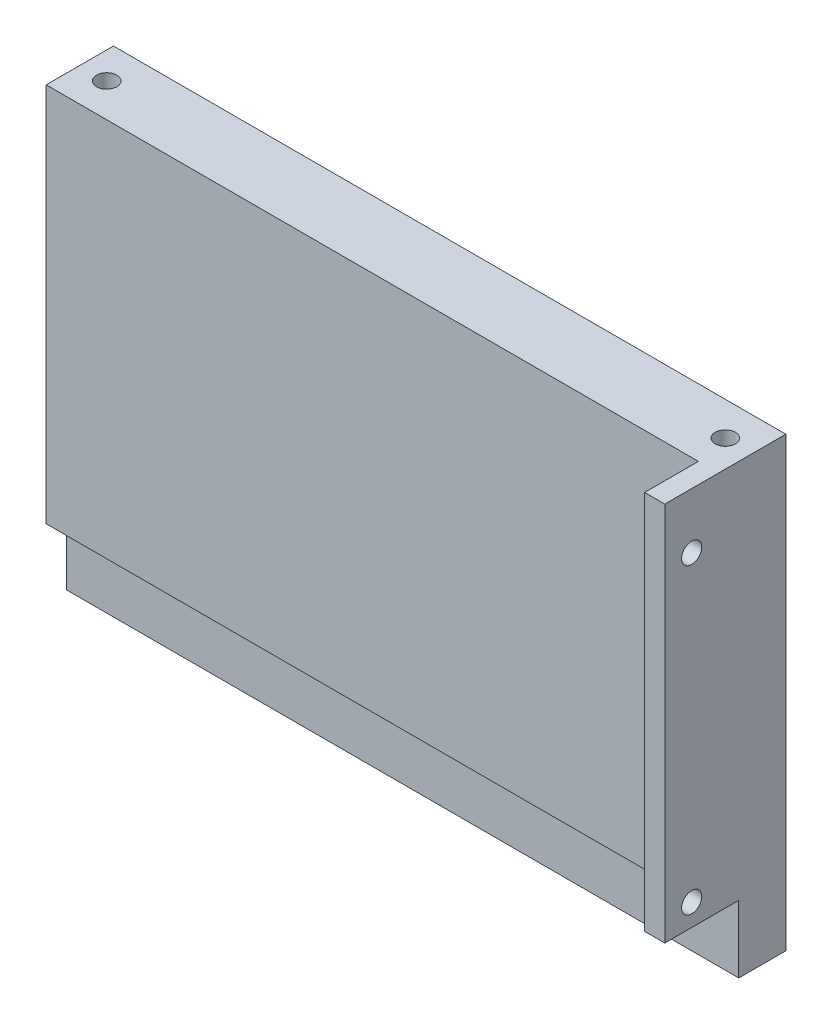
ISO-10303-21;
HEADER;
FILE_DESCRIPTION(('STEP AP214'),'2;1');
FILE_NAME('part.step','',(''),(''),'','','');
FILE_SCHEMA(('AUTOMOTIVE_DESIGN { 1 0 10303 214 1 1 1 1 }'));
ENDSEC;
DATA;
#1=APPLICATION_CONTEXT('core data for automotive mechanical design processes');
#2=APPLICATION_PROTOCOL_DEFINITION('international standard','automotive_design',2000,#1);
#3=PRODUCT_CONTEXT('',#1,'mechanical');
#4=PRODUCT('Part','Part','',(#3));
#5=PRODUCT_RELATED_PRODUCT_CATEGORY('part','',(#4));
#6=PRODUCT_DEFINITION_FORMATION('','',#4);
#7=PRODUCT_DEFINITION_CONTEXT('part definition',#1,'design');
#8=PRODUCT_DEFINITION('design','',#6,#7);
#9=PRODUCT_DEFINITION_SHAPE('','',#8);
#10=(LENGTH_UNIT() NAMED_UNIT(*) SI_UNIT(.MILLI.,.METRE.));
#11=(NAMED_UNIT(*) PLANE_ANGLE_UNIT() SI_UNIT($,.RADIAN.));
#12=(NAMED_UNIT(*) SI_UNIT($,.STERADIAN.) SOLID_ANGLE_UNIT());
#13=UNCERTAINTY_MEASURE_WITH_UNIT(LENGTH_MEASURE(1.E-05),#10,'distance_accuracy_value','');
#14=(GEOMETRIC_REPRESENTATION_CONTEXT(3) GLOBAL_UNCERTAINTY_ASSIGNED_CONTEXT((#13)) GLOBAL_UNIT_ASSIGNED_CONTEXT((#10,
#11,#12)) REPRESENTATION_CONTEXT('',''));
#15=CARTESIAN_POINT('',(0.,0.,0.));
#16=DIRECTION('',(0.,0.,1.));
#17=DIRECTION('',(1.,0.,0.));
#18=AXIS2_PLACEMENT_3D('',#15,#16,#17);
#19=CARTESIAN_POINT('',(-50.,66.54,5.));
#20=DIRECTION('',(0.,0.,-1.));
#21=DIRECTION('',(-1.,0.,0.));
#22=AXIS2_PLACEMENT_3D('',#19,#20,#21);
#23=PLANE('',#22);
#24=DIRECTION('',(0.,-1.,0.));
#25=VECTOR('',#24,1.);
#26=CARTESIAN_POINT('',(47.,66.54,5.));
#27=LINE('',#26,#25);
#28=CARTESIAN_POINT('',(47.,66.54,5.));
#29=VERTEX_POINT('',#28);
#30=CARTESIAN_POINT('',(47.,10.,5.));
#31=VERTEX_POINT('',#30);
#32=EDGE_CURVE('E58',#29,#31,#27,.T.);
#33=ORIENTED_EDGE('',*,*,#32,.F.);
#34=DIRECTION('',(1.,0.,0.));
#35=VECTOR('',#34,1.);
#36=CARTESIAN_POINT('',(-50.,66.54,5.));
#37=LINE('',#36,#35);
#38=CARTESIAN_POINT('',(-50.,66.54,5.));
#39=VERTEX_POINT('',#38);
#40=EDGE_CURVE('E197',#39,#29,#37,.T.);
#41=ORIENTED_EDGE('',*,*,#40,.F.);
#42=DIRECTION('',(0.,-1.,0.));
#43=VECTOR('',#42,1.);
#44=CARTESIAN_POINT('',(-50.,66.54,5.));
#45=LINE('',#44,#43);
#46=CARTESIAN_POINT('',(-50.,10.,5.));
#47=VERTEX_POINT('',#46);
#48=EDGE_CURVE('E200',#39,#47,#45,.T.);
#49=ORIENTED_EDGE('',*,*,#48,.T.);
#50=DIRECTION('',(-1.,0.,0.));
#51=VECTOR('',#50,1.);
#52=CARTESIAN_POINT('',(-50.,10.,5.));
#53=LINE('',#52,#51);
#54=EDGE_CURVE('E154',#31,#47,#53,.T.);
#55=ORIENTED_EDGE('',*,*,#54,.F.);
#56=EDGE_LOOP('',(#33,#41,#49,#55));
#57=FACE_BOUND('',#56,.T.);
#58=ADVANCED_FACE('F42',(#57),#23,.F.);
#59=CARTESIAN_POINT('',(50.,66.54,5.));
#60=DIRECTION('',(-1.,0.,0.));
#61=DIRECTION('',(0.,0.,1.));
#62=AXIS2_PLACEMENT_3D('',#59,#60,#61);
#63=PLANE('',#62);
#64=CARTESIAN_POINT('',(50.,58.27,9.));
#65=DIRECTION('',(1.,0.,0.));
#66=DIRECTION('',(0.,0.,-1.));
#67=AXIS2_PLACEMENT_3D('',#64,#65,#66);
#68=CIRCLE('',#67,1.5);
#69=CARTESIAN_POINT('',(50.,58.27,7.5));
#70=VERTEX_POINT('',#69);
#71=EDGE_CURVE('E397',#70,#70,#68,.T.);
#72=ORIENTED_EDGE('',*,*,#71,.F.);
#73=EDGE_LOOP('',(#72));
#74=FACE_BOUND('',#73,.T.);
#75=CARTESIAN_POINT('',(50.,13.27,9.));
#76=DIRECTION('',(1.,0.,0.));
#77=DIRECTION('',(0.,0.,-1.));
#78=AXIS2_PLACEMENT_3D('',#75,#76,#77);
#79=CIRCLE('',#78,1.5);
#80=CARTESIAN_POINT('',(50.,13.27,7.5));
#81=VERTEX_POINT('',#80);
#82=EDGE_CURVE('E141',#81,#81,#79,.T.);
#83=ORIENTED_EDGE('',*,*,#82,.F.);
#84=EDGE_LOOP('',(#83));
#85=FACE_BOUND('',#84,.T.);
#86=DIRECTION('',(0.,0.,-1.));
#87=VECTOR('',#86,1.);
#88=CARTESIAN_POINT('',(50.,66.54,5.));
#89=LINE('',#88,#87);
#90=CARTESIAN_POINT('',(50.,66.54,13.));
#91=VERTEX_POINT('',#90);
#92=CARTESIAN_POINT('',(50.,66.54,-5.));
#93=VERTEX_POINT('',#92);
#94=EDGE_CURVE('E111',#91,#93,#89,.T.);
#95=ORIENTED_EDGE('',*,*,#94,.F.);
#96=DIRECTION('',(0.,1.,0.));
#97=VECTOR('',#96,1.);
#98=CARTESIAN_POINT('',(50.,66.54,13.));
#99=LINE('',#98,#97);
#100=CARTESIAN_POINT('',(50.,10.,13.));
#101=VERTEX_POINT('',#100);
#102=EDGE_CURVE('E115',#101,#91,#99,.T.);
#103=ORIENTED_EDGE('',*,*,#102,.F.);
#104=DIRECTION('',(0.,0.,1.));
#105=VECTOR('',#104,1.);
#106=CARTESIAN_POINT('',(50.,10.,2.));
#107=LINE('',#106,#105);
#108=CARTESIAN_POINT('',(50.,10.,2.));
#109=VERTEX_POINT('',#108);
#110=EDGE_CURVE('E166',#109,#101,#107,.T.);
#111=ORIENTED_EDGE('',*,*,#110,.F.);
#112=DIRECTION('',(0.,1.,0.));
#113=VECTOR('',#112,1.);
#114=CARTESIAN_POINT('',(50.,0.,2.));
#115=LINE('',#114,#113);
#116=CARTESIAN_POINT('',(50.,0.,2.));
#117=VERTEX_POINT('',#116);
#118=EDGE_CURVE('E160',#117,#109,#115,.T.);
#119=ORIENTED_EDGE('',*,*,#118,.F.);
#120=DIRECTION('',(0.,0.,-1.));
#121=VECTOR('',#120,1.);
#122=CARTESIAN_POINT('',(50.,0.,5.));
#123=LINE('',#122,#121);
#124=CARTESIAN_POINT('',(50.,0.,-5.));
#125=VERTEX_POINT('',#124);
#126=EDGE_CURVE('E188',#117,#125,#123,.T.);
#127=ORIENTED_EDGE('',*,*,#126,.T.);
#128=DIRECTION('',(0.,-1.,0.));
#129=VECTOR('',#128,1.);
#130=CARTESIAN_POINT('',(50.,66.54,-5.));
#131=LINE('',#130,#129);
#132=EDGE_CURVE('E11',#93,#125,#131,.T.);
#133=ORIENTED_EDGE('',*,*,#132,.F.);
#134=EDGE_LOOP('',(#95,#103,#111,#119,#127,#133));
#135=FACE_BOUND('',#134,.T.);
#136=ADVANCED_FACE('F44',(#74,#85,#135),#63,.F.);
#137=CARTESIAN_POINT('',(-50.,66.54,-5.));
#138=DIRECTION('',(0.,0.,1.));
#139=DIRECTION('',(1.,0.,0.));
#140=AXIS2_PLACEMENT_3D('',#137,#138,#139);
#141=PLANE('',#140);
#142=DIRECTION('',(-1.,0.,0.));
#143=VECTOR('',#142,1.);
#144=CARTESIAN_POINT('',(-50.,0.,-5.));
#145=LINE('',#144,#143);
#146=CARTESIAN_POINT('',(-50.,0.,-5.));
#147=VERTEX_POINT('',#146);
#148=EDGE_CURVE('E203',#125,#147,#145,.T.);
#149=ORIENTED_EDGE('',*,*,#148,.T.);
#150=DIRECTION('',(0.,-1.,0.));
#151=VECTOR('',#150,1.);
#152=CARTESIAN_POINT('',(-50.,66.54,-5.));
#153=LINE('',#152,#151);
#154=CARTESIAN_POINT('',(-50.,66.54,-5.));
#155=VERTEX_POINT('',#154);
#156=EDGE_CURVE('E51',#155,#147,#153,.T.);
#157=ORIENTED_EDGE('',*,*,#156,.F.);
#158=DIRECTION('',(-1.,0.,0.));
#159=VECTOR('',#158,1.);
#160=CARTESIAN_POINT('',(-50.,66.54,-5.));
#161=LINE('',#160,#159);
#162=EDGE_CURVE('E118',#93,#155,#161,.T.);
#163=ORIENTED_EDGE('',*,*,#162,.F.);
#164=ORIENTED_EDGE('',*,*,#132,.T.);
#165=EDGE_LOOP('',(#149,#157,#163,#164));
#166=FACE_BOUND('',#165,.T.);
#167=ADVANCED_FACE('F250',(#166),#141,.F.);
#168=CARTESIAN_POINT('',(-50.,66.54,5.));
#169=DIRECTION('',(1.,0.,0.));
#170=DIRECTION('',(0.,0.,-1.));
#171=AXIS2_PLACEMENT_3D('',#168,#169,#170);
#172=PLANE('',#171);
#173=DIRECTION('',(0.,-1.,0.));
#174=VECTOR('',#173,1.);
#175=CARTESIAN_POINT('',(-50.,0.,2.));
#176=LINE('',#175,#174);
#177=CARTESIAN_POINT('',(-50.,10.,2.));
#178=VERTEX_POINT('',#177);
#179=CARTESIAN_POINT('',(-50.,0.,2.));
#180=VERTEX_POINT('',#179);
#181=EDGE_CURVE('E66',#178,#180,#176,.T.);
#182=ORIENTED_EDGE('',*,*,#181,.F.);
#183=DIRECTION('',(0.,0.,1.));
#184=VECTOR('',#183,1.);
#185=CARTESIAN_POINT('',(-50.,10.,2.));
#186=LINE('',#185,#184);
#187=EDGE_CURVE('E169',#178,#47,#186,.T.);
#188=ORIENTED_EDGE('',*,*,#187,.T.);
#189=ORIENTED_EDGE('',*,*,#48,.F.);
#190=DIRECTION('',(0.,0.,1.));
#191=VECTOR('',#190,1.);
#192=CARTESIAN_POINT('',(-50.,66.54,5.));
#193=LINE('',#192,#191);
#194=EDGE_CURVE('E194',#155,#39,#193,.T.);
#195=ORIENTED_EDGE('',*,*,#194,.F.);
#196=ORIENTED_EDGE('',*,*,#156,.T.);
#197=DIRECTION('',(0.,0.,1.));
#198=VECTOR('',#197,1.);
#199=CARTESIAN_POINT('',(-50.,0.,5.));
#200=LINE('',#199,#198);
#201=EDGE_CURVE('E119',#147,#180,#200,.T.);
#202=ORIENTED_EDGE('',*,*,#201,.T.);
#203=EDGE_LOOP('',(#182,#188,#189,#195,#196,#202));
#204=FACE_BOUND('',#203,.T.);
#205=ADVANCED_FACE('F217',(#204),#172,.F.);
#206=CARTESIAN_POINT('',(0.,66.54,0.));
#207=DIRECTION('',(0.,-1.,0.));
#208=DIRECTION('',(0.,0.,-1.));
#209=AXIS2_PLACEMENT_3D('',#206,#207,#208);
#210=PLANE('',#209);
#211=CARTESIAN_POINT('',(46.,66.54,0.));
#212=DIRECTION('',(0.,1.,0.));
#213=DIRECTION('',(0.,0.,1.));
#214=AXIS2_PLACEMENT_3D('',#211,#212,#213);
#215=CIRCLE('',#214,1.5);
#216=CARTESIAN_POINT('',(46.,66.54,1.5));
#217=VERTEX_POINT('',#216);
#218=EDGE_CURVE('E176',#217,#217,#215,.T.);
#219=ORIENTED_EDGE('',*,*,#218,.F.);
#220=EDGE_LOOP('',(#219));
#221=FACE_BOUND('',#220,.T.);
#222=CARTESIAN_POINT('',(-46.,66.54,0.));
#223=DIRECTION('',(0.,1.,0.));
#224=DIRECTION('',(0.,0.,1.));
#225=AXIS2_PLACEMENT_3D('',#222,#223,#224);
#226=CIRCLE('',#225,1.5);
#227=CARTESIAN_POINT('',(-46.,66.54,1.5));
#228=VERTEX_POINT('',#227);
#229=EDGE_CURVE('E184',#228,#228,#226,.T.);
#230=ORIENTED_EDGE('',*,*,#229,.F.);
#231=EDGE_LOOP('',(#230));
#232=FACE_BOUND('',#231,.T.);
#233=ORIENTED_EDGE('',*,*,#94,.T.);
#234=ORIENTED_EDGE('',*,*,#162,.T.);
#235=ORIENTED_EDGE('',*,*,#194,.T.);
#236=ORIENTED_EDGE('',*,*,#40,.T.);
#237=DIRECTION('',(0.,0.,-1.));
#238=VECTOR('',#237,1.);
#239=CARTESIAN_POINT('',(47.,66.54,13.));
#240=LINE('',#239,#238);
#241=CARTESIAN_POINT('',(47.,66.54,13.));
#242=VERTEX_POINT('',#241);
#243=EDGE_CURVE('E125',#242,#29,#240,.T.);
#244=ORIENTED_EDGE('',*,*,#243,.F.);
#245=DIRECTION('',(-1.,0.,0.));
#246=VECTOR('',#245,1.);
#247=CARTESIAN_POINT('',(50.,66.54,13.));
#248=LINE('',#247,#246);
#249=EDGE_CURVE('E122',#91,#242,#248,.T.);
#250=ORIENTED_EDGE('',*,*,#249,.F.);
#251=EDGE_LOOP('',(#233,#234,#235,#236,#244,#250));
#252=FACE_BOUND('',#251,.T.);
#253=ADVANCED_FACE('F123',(#221,#232,#252),#210,.F.);
#254=CARTESIAN_POINT('',(0.,0.,0.));
#255=DIRECTION('',(0.,-1.,0.));
#256=DIRECTION('',(0.,0.,-1.));
#257=AXIS2_PLACEMENT_3D('',#254,#255,#256);
#258=PLANE('',#257);
#259=DIRECTION('',(1.,0.,0.));
#260=VECTOR('',#259,1.);
#261=CARTESIAN_POINT('',(-50.,0.,2.));
#262=LINE('',#261,#260);
#263=EDGE_CURVE('E157',#180,#117,#262,.T.);
#264=ORIENTED_EDGE('',*,*,#263,.F.);
#265=ORIENTED_EDGE('',*,*,#201,.F.);
#266=ORIENTED_EDGE('',*,*,#148,.F.);
#267=ORIENTED_EDGE('',*,*,#126,.F.);
#268=EDGE_LOOP('',(#264,#265,#266,#267));
#269=FACE_BOUND('',#268,.T.);
#270=CARTESIAN_POINT('',(46.,0.,0.));
#271=DIRECTION('',(0.,-1.,0.));
#272=DIRECTION('',(0.,0.,-1.));
#273=AXIS2_PLACEMENT_3D('',#270,#271,#272);
#274=CIRCLE('',#273,1.5);
#275=CARTESIAN_POINT('',(46.,0.,-1.5));
#276=VERTEX_POINT('',#275);
#277=EDGE_CURVE('E173',#276,#276,#274,.F.);
#278=ORIENTED_EDGE('',*,*,#277,.T.);
#279=EDGE_LOOP('',(#278));
#280=FACE_BOUND('',#279,.T.);
#281=CARTESIAN_POINT('',(-46.,0.,0.));
#282=DIRECTION('',(0.,-1.,0.));
#283=DIRECTION('',(0.,0.,-1.));
#284=AXIS2_PLACEMENT_3D('',#281,#282,#283);
#285=CIRCLE('',#284,1.5);
#286=CARTESIAN_POINT('',(-46.,0.,-1.5));
#287=VERTEX_POINT('',#286);
#288=EDGE_CURVE('E180',#287,#287,#285,.F.);
#289=ORIENTED_EDGE('',*,*,#288,.T.);
#290=EDGE_LOOP('',(#289));
#291=FACE_BOUND('',#290,.T.);
#292=ADVANCED_FACE('F222',(#269,#280,#291),#258,.T.);
#293=CARTESIAN_POINT('',(-46.,-0.001000000000001,0.));
#294=DIRECTION('',(0.,1.,0.));
#295=DIRECTION('',(0.,0.,1.));
#296=AXIS2_PLACEMENT_3D('',#293,#294,#295);
#297=CYLINDRICAL_SURFACE('',#296,1.5);
#298=ORIENTED_EDGE('',*,*,#288,.F.);
#299=EDGE_LOOP('',(#298));
#300=FACE_BOUND('',#299,.T.);
#301=ORIENTED_EDGE('',*,*,#229,.T.);
#302=EDGE_LOOP('',(#301));
#303=FACE_BOUND('',#302,.T.);
#304=ADVANCED_FACE('F280',(#300,#303),#297,.F.);
#305=CARTESIAN_POINT('',(46.,-0.001000000000001,0.));
#306=DIRECTION('',(0.,1.,0.));
#307=DIRECTION('',(0.,0.,1.));
#308=AXIS2_PLACEMENT_3D('',#305,#306,#307);
#309=CYLINDRICAL_SURFACE('',#308,1.5);
#310=ORIENTED_EDGE('',*,*,#277,.F.);
#311=EDGE_LOOP('',(#310));
#312=FACE_BOUND('',#311,.T.);
#313=ORIENTED_EDGE('',*,*,#218,.T.);
#314=EDGE_LOOP('',(#313));
#315=FACE_BOUND('',#314,.T.);
#316=ADVANCED_FACE('F286',(#312,#315),#309,.F.);
#317=CARTESIAN_POINT('',(-50.,10.,2.));
#318=DIRECTION('',(0.,1.,0.));
#319=DIRECTION('',(-1.,0.,0.));
#320=AXIS2_PLACEMENT_3D('',#317,#318,#319);
#321=PLANE('',#320);
#322=ORIENTED_EDGE('',*,*,#110,.T.);
#323=DIRECTION('',(1.,0.,0.));
#324=VECTOR('',#323,1.);
#325=CARTESIAN_POINT('',(50.,10.,13.));
#326=LINE('',#325,#324);
#327=CARTESIAN_POINT('',(47.,10.,13.));
#328=VERTEX_POINT('',#327);
#329=EDGE_CURVE('E134',#328,#101,#326,.T.);
#330=ORIENTED_EDGE('',*,*,#329,.F.);
#331=DIRECTION('',(0.,0.,-1.));
#332=VECTOR('',#331,1.);
#333=CARTESIAN_POINT('',(47.,10.,13.));
#334=LINE('',#333,#332);
#335=EDGE_CURVE('E147',#328,#31,#334,.T.);
#336=ORIENTED_EDGE('',*,*,#335,.T.);
#337=ORIENTED_EDGE('',*,*,#54,.T.);
#338=ORIENTED_EDGE('',*,*,#187,.F.);
#339=DIRECTION('',(-1.,0.,0.));
#340=VECTOR('',#339,1.);
#341=CARTESIAN_POINT('',(-50.,10.,2.));
#342=LINE('',#341,#340);
#343=EDGE_CURVE('E163',#109,#178,#342,.T.);
#344=ORIENTED_EDGE('',*,*,#343,.F.);
#345=EDGE_LOOP('',(#322,#330,#336,#337,#338,#344));
#346=FACE_BOUND('',#345,.T.);
#347=ADVANCED_FACE('F229',(#346),#321,.F.);
#348=CARTESIAN_POINT('',(0.,0.,2.));
#349=DIRECTION('',(0.,0.,-1.));
#350=DIRECTION('',(-1.,0.,0.));
#351=AXIS2_PLACEMENT_3D('',#348,#349,#350);
#352=PLANE('',#351);
#353=ORIENTED_EDGE('',*,*,#181,.T.);
#354=ORIENTED_EDGE('',*,*,#263,.T.);
#355=ORIENTED_EDGE('',*,*,#118,.T.);
#356=ORIENTED_EDGE('',*,*,#343,.T.);
#357=EDGE_LOOP('',(#353,#354,#355,#356));
#358=FACE_BOUND('',#357,.T.);
#359=ADVANCED_FACE('F226',(#358),#352,.F.);
#360=CARTESIAN_POINT('',(47.,66.54,13.));
#361=DIRECTION('',(1.,0.,0.));
#362=DIRECTION('',(0.,1.,0.));
#363=AXIS2_PLACEMENT_3D('',#360,#361,#362);
#364=PLANE('',#363);
#365=CARTESIAN_POINT('',(47.,58.27,9.));
#366=DIRECTION('',(1.,0.,0.));
#367=DIRECTION('',(0.,1.,0.));
#368=AXIS2_PLACEMENT_3D('',#365,#366,#367);
#369=CIRCLE('',#368,1.5);
#370=CARTESIAN_POINT('',(47.,59.77,9.));
#371=VERTEX_POINT('',#370);
#372=EDGE_CURVE('E138',#371,#371,#369,.F.);
#373=ORIENTED_EDGE('',*,*,#372,.F.);
#374=EDGE_LOOP('',(#373));
#375=FACE_BOUND('',#374,.T.);
#376=CARTESIAN_POINT('',(47.,13.27,9.));
#377=DIRECTION('',(1.,0.,0.));
#378=DIRECTION('',(0.,1.,0.));
#379=AXIS2_PLACEMENT_3D('',#376,#377,#378);
#380=CIRCLE('',#379,1.5);
#381=CARTESIAN_POINT('',(47.,14.77,9.));
#382=VERTEX_POINT('',#381);
#383=EDGE_CURVE('E403',#382,#382,#380,.F.);
#384=ORIENTED_EDGE('',*,*,#383,.F.);
#385=EDGE_LOOP('',(#384));
#386=FACE_BOUND('',#385,.T.);
#387=ORIENTED_EDGE('',*,*,#32,.T.);
#388=ORIENTED_EDGE('',*,*,#335,.F.);
#389=DIRECTION('',(0.,-1.,0.));
#390=VECTOR('',#389,1.);
#391=CARTESIAN_POINT('',(47.,66.54,13.));
#392=LINE('',#391,#390);
#393=EDGE_CURVE('E129',#242,#328,#392,.T.);
#394=ORIENTED_EDGE('',*,*,#393,.F.);
#395=ORIENTED_EDGE('',*,*,#243,.T.);
#396=EDGE_LOOP('',(#387,#388,#394,#395));
#397=FACE_BOUND('',#396,.T.);
#398=ADVANCED_FACE('F231',(#375,#386,#397),#364,.F.);
#399=CARTESIAN_POINT('',(0.,0.,13.));
#400=DIRECTION('',(0.,0.,-1.));
#401=DIRECTION('',(-1.,0.,0.));
#402=AXIS2_PLACEMENT_3D('',#399,#400,#401);
#403=PLANE('',#402);
#404=ORIENTED_EDGE('',*,*,#102,.T.);
#405=ORIENTED_EDGE('',*,*,#249,.T.);
#406=ORIENTED_EDGE('',*,*,#393,.T.);
#407=ORIENTED_EDGE('',*,*,#329,.T.);
#408=EDGE_LOOP('',(#404,#405,#406,#407));
#409=FACE_BOUND('',#408,.T.);
#410=ADVANCED_FACE('F132',(#409),#403,.F.);
#411=CARTESIAN_POINT('',(-50.001,13.27,9.));
#412=DIRECTION('',(1.,0.,0.));
#413=DIRECTION('',(0.,0.,-1.));
#414=AXIS2_PLACEMENT_3D('',#411,#412,#413);
#415=CYLINDRICAL_SURFACE('',#414,1.5);
#416=ORIENTED_EDGE('',*,*,#82,.T.);
#417=EDGE_LOOP('',(#416));
#418=FACE_BOUND('',#417,.T.);
#419=ORIENTED_EDGE('',*,*,#383,.T.);
#420=EDGE_LOOP('',(#419));
#421=FACE_BOUND('',#420,.T.);
#422=ADVANCED_FACE('F240',(#418,#421),#415,.F.);
#423=CARTESIAN_POINT('',(-50.001,58.27,9.));
#424=DIRECTION('',(1.,0.,0.));
#425=DIRECTION('',(0.,0.,-1.));
#426=AXIS2_PLACEMENT_3D('',#423,#424,#425);
#427=CYLINDRICAL_SURFACE('',#426,1.5);
#428=ORIENTED_EDGE('',*,*,#71,.T.);
#429=EDGE_LOOP('',(#428));
#430=FACE_BOUND('',#429,.T.);
#431=ORIENTED_EDGE('',*,*,#372,.T.);
#432=EDGE_LOOP('',(#431));
#433=FACE_BOUND('',#432,.T.);
#434=ADVANCED_FACE('F333',(#430,#433),#427,.F.);
#435=CLOSED_SHELL('',(#58,#136,#167,#205,#253,#292,#304,#316,#347,#359,#398,#410,#422,#434));
#436=MANIFOLD_SOLID_BREP('B2',#435);
#437=ADVANCED_BREP_SHAPE_REPRESENTATION('',(#18,#436),#14);
#438=SHAPE_DEFINITION_REPRESENTATION(#9,#437);
ENDSEC;
END-ISO-10303-21;
